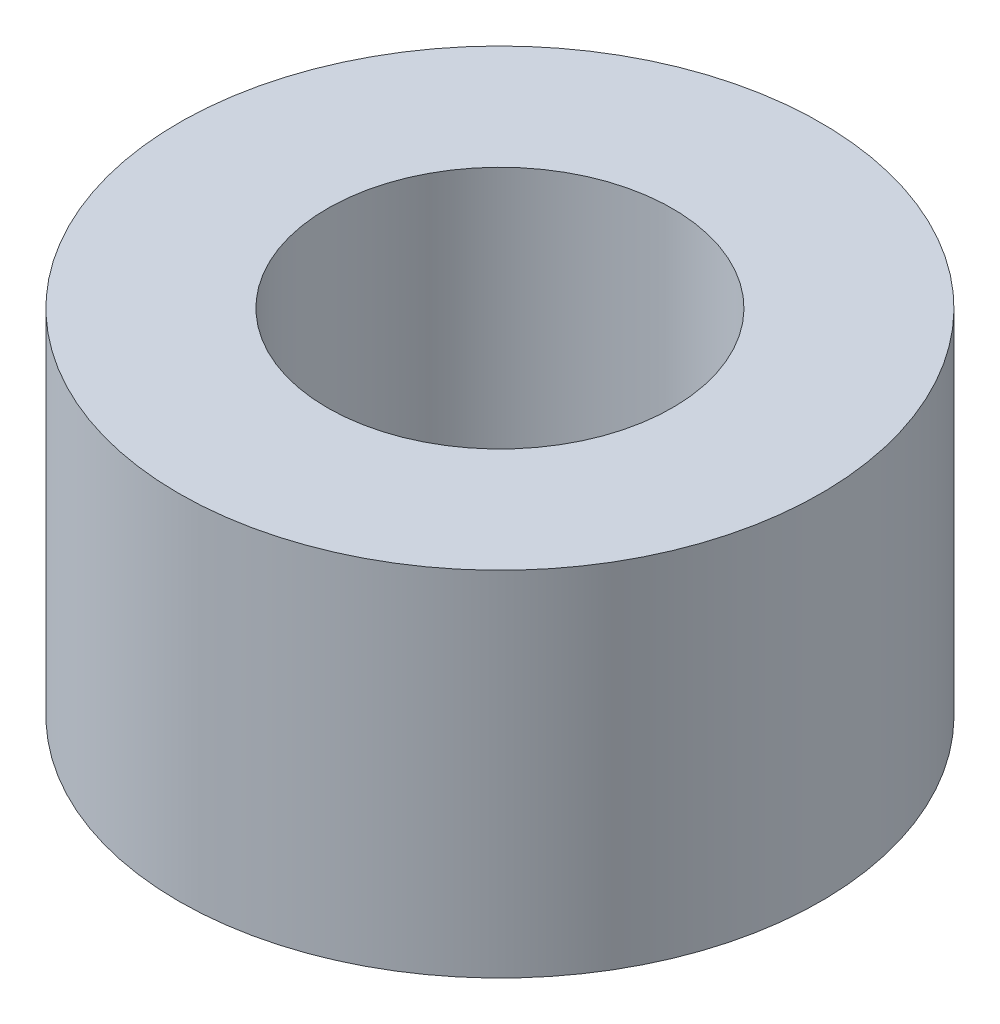
ISO-10303-21;
HEADER;
FILE_DESCRIPTION(('STEP AP214'),'2;1');
FILE_NAME('part.step','',(''),(''),'','','');
FILE_SCHEMA(('AUTOMOTIVE_DESIGN { 1 0 10303 214 1 1 1 1 }'));
ENDSEC;
DATA;
#1=APPLICATION_CONTEXT('core data for automotive mechanical design processes');
#2=APPLICATION_PROTOCOL_DEFINITION('international standard','automotive_design',2000,#1);
#3=PRODUCT_CONTEXT('',#1,'mechanical');
#4=PRODUCT('Part','Part','',(#3));
#5=PRODUCT_RELATED_PRODUCT_CATEGORY('part','',(#4));
#6=PRODUCT_DEFINITION_FORMATION('','',#4);
#7=PRODUCT_DEFINITION_CONTEXT('part definition',#1,'design');
#8=PRODUCT_DEFINITION('design','',#6,#7);
#9=PRODUCT_DEFINITION_SHAPE('','',#8);
#10=(LENGTH_UNIT() NAMED_UNIT(*) SI_UNIT(.MILLI.,.METRE.));
#11=(NAMED_UNIT(*) PLANE_ANGLE_UNIT() SI_UNIT($,.RADIAN.));
#12=(NAMED_UNIT(*) SI_UNIT($,.STERADIAN.) SOLID_ANGLE_UNIT());
#13=UNCERTAINTY_MEASURE_WITH_UNIT(LENGTH_MEASURE(1.E-05),#10,'distance_accuracy_value','');
#14=(GEOMETRIC_REPRESENTATION_CONTEXT(3) GLOBAL_UNCERTAINTY_ASSIGNED_CONTEXT((#13)) GLOBAL_UNIT_ASSIGNED_CONTEXT((#10,
#11,#12)) REPRESENTATION_CONTEXT('',''));
#15=CARTESIAN_POINT('',(0.,0.,0.));
#16=DIRECTION('',(0.,0.,1.));
#17=DIRECTION('',(1.,0.,0.));
#18=AXIS2_PLACEMENT_3D('',#15,#16,#17);
#19=CARTESIAN_POINT('',(0.,12.3625,15.04));
#20=DIRECTION('',(0.,1.,0.));
#21=DIRECTION('',(0.,0.,1.));
#22=AXIS2_PLACEMENT_3D('',#19,#20,#21);
#23=PLANE('',#22);
#24=CARTESIAN_POINT('',(0.,12.3625,15.04));
#25=DIRECTION('',(0.,1.,0.));
#26=DIRECTION('',(0.,0.,1.));
#27=AXIS2_PLACEMENT_3D('',#24,#25,#26);
#28=CIRCLE('',#27,4.);
#29=CARTESIAN_POINT('',(0.,12.3625,19.04));
#30=VERTEX_POINT('',#29);
#31=EDGE_CURVE('E10',#30,#30,#28,.T.);
#32=ORIENTED_EDGE('',*,*,#31,.T.);
#33=EDGE_LOOP('',(#32));
#34=FACE_BOUND('',#33,.T.);
#35=CARTESIAN_POINT('',(0.,12.3625,15.04));
#36=DIRECTION('',(0.,1.,0.));
#37=DIRECTION('',(0.,0.,1.));
#38=AXIS2_PLACEMENT_3D('',#35,#36,#37);
#39=CIRCLE('',#38,2.15);
#40=CARTESIAN_POINT('',(0.,12.3625,17.19));
#41=VERTEX_POINT('',#40);
#42=EDGE_CURVE('E49',#41,#41,#39,.T.);
#43=ORIENTED_EDGE('',*,*,#42,.F.);
#44=EDGE_LOOP('',(#43));
#45=FACE_BOUND('',#44,.T.);
#46=ADVANCED_FACE('F39',(#34,#45),#23,.T.);
#47=CARTESIAN_POINT('',(0.,7.9625,15.04));
#48=DIRECTION('',(0.,1.,0.));
#49=DIRECTION('',(0.,0.,1.));
#50=AXIS2_PLACEMENT_3D('',#47,#48,#49);
#51=PLANE('',#50);
#52=CARTESIAN_POINT('',(0.,7.9625,15.04));
#53=DIRECTION('',(0.,1.,0.));
#54=DIRECTION('',(0.,0.,1.));
#55=AXIS2_PLACEMENT_3D('',#52,#53,#54);
#56=CIRCLE('',#55,4.);
#57=CARTESIAN_POINT('',(0.,7.9625,19.04));
#58=VERTEX_POINT('',#57);
#59=EDGE_CURVE('E43',#58,#58,#56,.T.);
#60=ORIENTED_EDGE('',*,*,#59,.F.);
#61=EDGE_LOOP('',(#60));
#62=FACE_BOUND('',#61,.T.);
#63=CARTESIAN_POINT('',(0.,7.9625,15.04));
#64=DIRECTION('',(0.,1.,0.));
#65=DIRECTION('',(0.,0.,1.));
#66=AXIS2_PLACEMENT_3D('',#63,#64,#65);
#67=CIRCLE('',#66,2.15);
#68=CARTESIAN_POINT('',(0.,7.9625,17.19));
#69=VERTEX_POINT('',#68);
#70=EDGE_CURVE('E55',#69,#69,#67,.T.);
#71=ORIENTED_EDGE('',*,*,#70,.T.);
#72=EDGE_LOOP('',(#71));
#73=FACE_BOUND('',#72,.T.);
#74=ADVANCED_FACE('F65',(#62,#73),#51,.F.);
#75=CARTESIAN_POINT('',(0.,12.3625,15.04));
#76=DIRECTION('',(0.,-1.,0.));
#77=DIRECTION('',(0.,0.,-1.));
#78=AXIS2_PLACEMENT_3D('',#75,#76,#77);
#79=CYLINDRICAL_SURFACE('',#78,4.);
#80=ORIENTED_EDGE('',*,*,#31,.F.);
#81=EDGE_LOOP('',(#80));
#82=FACE_BOUND('',#81,.T.);
#83=ORIENTED_EDGE('',*,*,#59,.T.);
#84=EDGE_LOOP('',(#83));
#85=FACE_BOUND('',#84,.T.);
#86=ADVANCED_FACE('F41',(#82,#85),#79,.T.);
#87=CARTESIAN_POINT('',(0.,12.3625,15.04));
#88=DIRECTION('',(0.,-1.,0.));
#89=DIRECTION('',(0.,0.,-1.));
#90=AXIS2_PLACEMENT_3D('',#87,#88,#89);
#91=CYLINDRICAL_SURFACE('',#90,2.15);
#92=ORIENTED_EDGE('',*,*,#42,.T.);
#93=EDGE_LOOP('',(#92));
#94=FACE_BOUND('',#93,.T.);
#95=ORIENTED_EDGE('',*,*,#70,.F.);
#96=EDGE_LOOP('',(#95));
#97=FACE_BOUND('',#96,.T.);
#98=ADVANCED_FACE('F59',(#94,#97),#91,.F.);
#99=CLOSED_SHELL('',(#46,#74,#86,#98));
#100=MANIFOLD_SOLID_BREP('B2',#99);
#101=ADVANCED_BREP_SHAPE_REPRESENTATION('',(#18,#100),#14);
#102=SHAPE_DEFINITION_REPRESENTATION(#9,#101);
ENDSEC;
END-ISO-10303-21;
